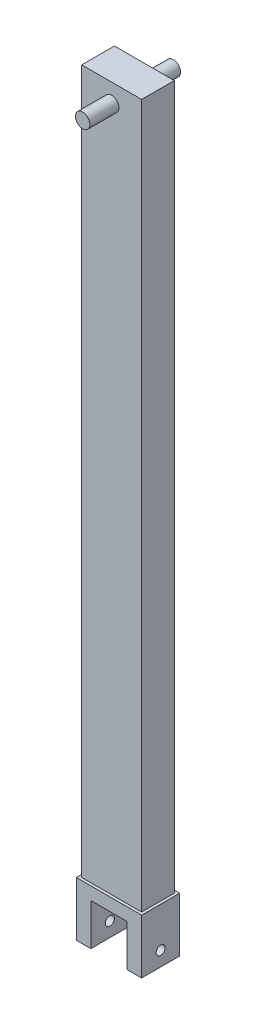
ISO-10303-21;
HEADER;
FILE_DESCRIPTION(('STEP AP214'),'2;1');
FILE_NAME('part.step','',(''),(''),'','','');
FILE_SCHEMA(('AUTOMOTIVE_DESIGN { 1 0 10303 214 1 1 1 1 }'));
ENDSEC;
DATA;
#1=APPLICATION_CONTEXT('core data for automotive mechanical design processes');
#2=APPLICATION_PROTOCOL_DEFINITION('international standard','automotive_design',2000,#1);
#3=PRODUCT_CONTEXT('',#1,'mechanical');
#4=PRODUCT('Part','Part','',(#3));
#5=PRODUCT_RELATED_PRODUCT_CATEGORY('part','',(#4));
#6=PRODUCT_DEFINITION_FORMATION('','',#4);
#7=PRODUCT_DEFINITION_CONTEXT('part definition',#1,'design');
#8=PRODUCT_DEFINITION('design','',#6,#7);
#9=PRODUCT_DEFINITION_SHAPE('','',#8);
#10=(LENGTH_UNIT() NAMED_UNIT(*) SI_UNIT(.MILLI.,.METRE.));
#11=(NAMED_UNIT(*) PLANE_ANGLE_UNIT() SI_UNIT($,.RADIAN.));
#12=(NAMED_UNIT(*) SI_UNIT($,.STERADIAN.) SOLID_ANGLE_UNIT());
#13=UNCERTAINTY_MEASURE_WITH_UNIT(LENGTH_MEASURE(1.E-05),#10,'distance_accuracy_value','');
#14=(GEOMETRIC_REPRESENTATION_CONTEXT(3) GLOBAL_UNCERTAINTY_ASSIGNED_CONTEXT((#13)) GLOBAL_UNIT_ASSIGNED_CONTEXT((#10,
#11,#12)) REPRESENTATION_CONTEXT('',''));
#15=CARTESIAN_POINT('',(0.,0.,0.));
#16=DIRECTION('',(0.,0.,1.));
#17=DIRECTION('',(1.,0.,0.));
#18=AXIS2_PLACEMENT_3D('',#15,#16,#17);
#19=CARTESIAN_POINT('',(0.,-30.,0.));
#20=DIRECTION('',(0.,-1.,0.));
#21=DIRECTION('',(0.,0.,-1.));
#22=AXIS2_PLACEMENT_3D('',#19,#20,#21);
#23=PLANE('',#22);
#24=DIRECTION('',(0.,0.,1.));
#25=VECTOR('',#24,1.);
#26=CARTESIAN_POINT('',(10.,-30.,0.));
#27=LINE('',#26,#25);
#28=CARTESIAN_POINT('',(10.,-30.,-10.5));
#29=VERTEX_POINT('',#28);
#30=CARTESIAN_POINT('',(10.,-30.,10.5));
#31=VERTEX_POINT('',#30);
#32=EDGE_CURVE('E44',#29,#31,#27,.T.);
#33=ORIENTED_EDGE('',*,*,#32,.F.);
#34=DIRECTION('',(1.,0.,0.));
#35=VECTOR('',#34,1.);
#36=CARTESIAN_POINT('',(-18.,-30.,-10.5));
#37=LINE('',#36,#35);
#38=CARTESIAN_POINT('',(18.,-30.,-10.5));
#39=VERTEX_POINT('',#38);
#40=EDGE_CURVE('E171',#29,#39,#37,.T.);
#41=ORIENTED_EDGE('',*,*,#40,.T.);
#42=DIRECTION('',(0.,0.,1.));
#43=VECTOR('',#42,1.);
#44=CARTESIAN_POINT('',(18.,-30.,10.5));
#45=LINE('',#44,#43);
#46=CARTESIAN_POINT('',(18.,-30.,10.5));
#47=VERTEX_POINT('',#46);
#48=EDGE_CURVE('E165',#39,#47,#45,.T.);
#49=ORIENTED_EDGE('',*,*,#48,.T.);
#50=DIRECTION('',(-1.,0.,0.));
#51=VECTOR('',#50,1.);
#52=CARTESIAN_POINT('',(-18.,-30.,10.5));
#53=LINE('',#52,#51);
#54=EDGE_CURVE('E158',#47,#31,#53,.T.);
#55=ORIENTED_EDGE('',*,*,#54,.T.);
#56=EDGE_LOOP('',(#33,#41,#49,#55));
#57=FACE_BOUND('',#56,.T.);
#58=ADVANCED_FACE('F35',(#57),#23,.T.);
#59=CARTESIAN_POINT('',(-16.5,388.,-9.));
#60=DIRECTION('',(0.,0.,1.));
#61=DIRECTION('',(1.,0.,0.));
#62=AXIS2_PLACEMENT_3D('',#59,#60,#61);
#63=PLANE('',#62);
#64=DIRECTION('',(-1.,0.,0.));
#65=VECTOR('',#64,1.);
#66=CARTESIAN_POINT('',(-16.5,0.,-9.));
#67=LINE('',#66,#65);
#68=CARTESIAN_POINT('',(16.5,0.,-9.));
#69=VERTEX_POINT('',#68);
#70=CARTESIAN_POINT('',(-16.5,0.,-9.));
#71=VERTEX_POINT('',#70);
#72=EDGE_CURVE('E81',#69,#71,#67,.T.);
#73=ORIENTED_EDGE('',*,*,#72,.T.);
#74=DIRECTION('',(0.,-1.,0.));
#75=VECTOR('',#74,1.);
#76=CARTESIAN_POINT('',(-16.5,388.,-9.));
#77=LINE('',#76,#75);
#78=CARTESIAN_POINT('',(-16.5,388.,-9.));
#79=VERTEX_POINT('',#78);
#80=EDGE_CURVE('E99',#79,#71,#77,.T.);
#81=ORIENTED_EDGE('',*,*,#80,.F.);
#82=DIRECTION('',(-1.,0.,0.));
#83=VECTOR('',#82,1.);
#84=CARTESIAN_POINT('',(-16.5,388.,-9.));
#85=LINE('',#84,#83);
#86=CARTESIAN_POINT('',(16.5,388.,-9.));
#87=VERTEX_POINT('',#86);
#88=EDGE_CURVE('E87',#87,#79,#85,.T.);
#89=ORIENTED_EDGE('',*,*,#88,.F.);
#90=DIRECTION('',(0.,-1.,0.));
#91=VECTOR('',#90,1.);
#92=CARTESIAN_POINT('',(16.5,388.,-9.));
#93=LINE('',#92,#91);
#94=EDGE_CURVE('E103',#87,#69,#93,.T.);
#95=ORIENTED_EDGE('',*,*,#94,.T.);
#96=EDGE_LOOP('',(#73,#81,#89,#95));
#97=FACE_BOUND('',#96,.T.);
#98=CARTESIAN_POINT('',(0.,377.75,-9.));
#99=DIRECTION('',(0.,0.,1.));
#100=DIRECTION('',(1.,0.,0.));
#101=AXIS2_PLACEMENT_3D('',#98,#99,#100);
#102=CIRCLE('',#101,4.);
#103=CARTESIAN_POINT('',(4.,377.75,-9.));
#104=VERTEX_POINT('',#103);
#105=EDGE_CURVE('E128',#104,#104,#102,.F.);
#106=ORIENTED_EDGE('',*,*,#105,.F.);
#107=EDGE_LOOP('',(#106));
#108=FACE_BOUND('',#107,.T.);
#109=ADVANCED_FACE('F100',(#97,#108),#63,.F.);
#110=CARTESIAN_POINT('',(-16.5,388.,9.));
#111=DIRECTION('',(0.,0.,-1.));
#112=DIRECTION('',(-1.,0.,0.));
#113=AXIS2_PLACEMENT_3D('',#110,#111,#112);
#114=PLANE('',#113);
#115=DIRECTION('',(1.,0.,0.));
#116=VECTOR('',#115,1.);
#117=CARTESIAN_POINT('',(-16.5,0.,9.));
#118=LINE('',#117,#116);
#119=CARTESIAN_POINT('',(-16.5,0.,9.));
#120=VERTEX_POINT('',#119);
#121=CARTESIAN_POINT('',(16.5,0.,9.));
#122=VERTEX_POINT('',#121);
#123=EDGE_CURVE('E73',#120,#122,#118,.T.);
#124=ORIENTED_EDGE('',*,*,#123,.T.);
#125=DIRECTION('',(0.,-1.,0.));
#126=VECTOR('',#125,1.);
#127=CARTESIAN_POINT('',(16.5,388.,9.));
#128=LINE('',#127,#126);
#129=CARTESIAN_POINT('',(16.5,388.,9.));
#130=VERTEX_POINT('',#129);
#131=EDGE_CURVE('E109',#130,#122,#128,.T.);
#132=ORIENTED_EDGE('',*,*,#131,.F.);
#133=DIRECTION('',(1.,0.,0.));
#134=VECTOR('',#133,1.);
#135=CARTESIAN_POINT('',(-16.5,388.,9.));
#136=LINE('',#135,#134);
#137=CARTESIAN_POINT('',(-16.5,388.,9.));
#138=VERTEX_POINT('',#137);
#139=EDGE_CURVE('E60',#138,#130,#136,.T.);
#140=ORIENTED_EDGE('',*,*,#139,.F.);
#141=DIRECTION('',(0.,-1.,0.));
#142=VECTOR('',#141,1.);
#143=CARTESIAN_POINT('',(-16.5,388.,9.));
#144=LINE('',#143,#142);
#145=EDGE_CURVE('E104',#138,#120,#144,.T.);
#146=ORIENTED_EDGE('',*,*,#145,.T.);
#147=EDGE_LOOP('',(#124,#132,#140,#146));
#148=FACE_BOUND('',#147,.T.);
#149=CARTESIAN_POINT('',(0.,377.75,9.));
#150=DIRECTION('',(0.,0.,-1.));
#151=DIRECTION('',(-1.,0.,0.));
#152=AXIS2_PLACEMENT_3D('',#149,#150,#151);
#153=CIRCLE('',#152,4.);
#154=CARTESIAN_POINT('',(-4.,377.75,9.));
#155=VERTEX_POINT('',#154);
#156=EDGE_CURVE('E125',#155,#155,#153,.F.);
#157=ORIENTED_EDGE('',*,*,#156,.F.);
#158=EDGE_LOOP('',(#157));
#159=FACE_BOUND('',#158,.T.);
#160=ADVANCED_FACE('F213',(#148,#159),#114,.F.);
#161=CARTESIAN_POINT('',(16.5,388.,-9.));
#162=DIRECTION('',(-1.,0.,0.));
#163=DIRECTION('',(0.,0.,1.));
#164=AXIS2_PLACEMENT_3D('',#161,#162,#163);
#165=PLANE('',#164);
#166=DIRECTION('',(0.,0.,-1.));
#167=VECTOR('',#166,1.);
#168=CARTESIAN_POINT('',(16.5,0.,-9.));
#169=LINE('',#168,#167);
#170=EDGE_CURVE('E113',#122,#69,#169,.T.);
#171=ORIENTED_EDGE('',*,*,#170,.T.);
#172=ORIENTED_EDGE('',*,*,#94,.F.);
#173=DIRECTION('',(0.,0.,-1.));
#174=VECTOR('',#173,1.);
#175=CARTESIAN_POINT('',(16.5,388.,-9.));
#176=LINE('',#175,#174);
#177=EDGE_CURVE('E94',#130,#87,#176,.T.);
#178=ORIENTED_EDGE('',*,*,#177,.F.);
#179=ORIENTED_EDGE('',*,*,#131,.T.);
#180=EDGE_LOOP('',(#171,#172,#178,#179));
#181=FACE_BOUND('',#180,.T.);
#182=ADVANCED_FACE('F37',(#181),#165,.F.);
#183=CARTESIAN_POINT('',(-16.5,388.,-9.));
#184=DIRECTION('',(1.,0.,0.));
#185=DIRECTION('',(0.,0.,-1.));
#186=AXIS2_PLACEMENT_3D('',#183,#184,#185);
#187=PLANE('',#186);
#188=DIRECTION('',(0.,0.,1.));
#189=VECTOR('',#188,1.);
#190=CARTESIAN_POINT('',(-16.5,0.,-9.));
#191=LINE('',#190,#189);
#192=EDGE_CURVE('E118',#71,#120,#191,.T.);
#193=ORIENTED_EDGE('',*,*,#192,.T.);
#194=ORIENTED_EDGE('',*,*,#145,.F.);
#195=DIRECTION('',(0.,0.,1.));
#196=VECTOR('',#195,1.);
#197=CARTESIAN_POINT('',(-16.5,388.,-9.));
#198=LINE('',#197,#196);
#199=EDGE_CURVE('E91',#79,#138,#198,.T.);
#200=ORIENTED_EDGE('',*,*,#199,.F.);
#201=ORIENTED_EDGE('',*,*,#80,.T.);
#202=EDGE_LOOP('',(#193,#194,#200,#201));
#203=FACE_BOUND('',#202,.T.);
#204=ADVANCED_FACE('F106',(#203),#187,.F.);
#205=CARTESIAN_POINT('',(0.,388.,0.));
#206=DIRECTION('',(0.,1.,0.));
#207=DIRECTION('',(0.,0.,1.));
#208=AXIS2_PLACEMENT_3D('',#205,#206,#207);
#209=PLANE('',#208);
#210=ORIENTED_EDGE('',*,*,#177,.T.);
#211=ORIENTED_EDGE('',*,*,#88,.T.);
#212=ORIENTED_EDGE('',*,*,#199,.T.);
#213=ORIENTED_EDGE('',*,*,#139,.T.);
#214=EDGE_LOOP('',(#210,#211,#212,#213));
#215=FACE_BOUND('',#214,.T.);
#216=ADVANCED_FACE('F89',(#215),#209,.T.);
#217=CARTESIAN_POINT('',(0.,377.75,25.));
#218=DIRECTION('',(0.,0.,1.));
#219=DIRECTION('',(1.,0.,0.));
#220=AXIS2_PLACEMENT_3D('',#217,#218,#219);
#221=PLANE('',#220);
#222=CARTESIAN_POINT('',(0.,377.75,25.));
#223=DIRECTION('',(0.,0.,1.));
#224=DIRECTION('',(1.,0.,0.));
#225=AXIS2_PLACEMENT_3D('',#222,#223,#224);
#226=CIRCLE('',#225,4.);
#227=CARTESIAN_POINT('',(4.,377.75,25.));
#228=VERTEX_POINT('',#227);
#229=EDGE_CURVE('E116',#228,#228,#226,.T.);
#230=ORIENTED_EDGE('',*,*,#229,.T.);
#231=EDGE_LOOP('',(#230));
#232=FACE_BOUND('',#231,.T.);
#233=ADVANCED_FACE('F228',(#232),#221,.T.);
#234=CARTESIAN_POINT('',(0.,377.75,25.));
#235=DIRECTION('',(0.,0.,-1.));
#236=DIRECTION('',(-1.,0.,0.));
#237=AXIS2_PLACEMENT_3D('',#234,#235,#236);
#238=CYLINDRICAL_SURFACE('',#237,4.);
#239=ORIENTED_EDGE('',*,*,#229,.F.);
#240=EDGE_LOOP('',(#239));
#241=FACE_BOUND('',#240,.T.);
#242=ORIENTED_EDGE('',*,*,#156,.T.);
#243=EDGE_LOOP('',(#242));
#244=FACE_BOUND('',#243,.T.);
#245=ADVANCED_FACE('F232',(#241,#244),#238,.T.);
#246=CARTESIAN_POINT('',(0.,377.75,-25.));
#247=DIRECTION('',(0.,0.,1.));
#248=DIRECTION('',(1.,0.,0.));
#249=AXIS2_PLACEMENT_3D('',#246,#247,#248);
#250=CIRCLE('',#249,4.);
#251=CARTESIAN_POINT('',(4.,377.75,-25.));
#252=VERTEX_POINT('',#251);
#253=EDGE_CURVE('E203',#252,#252,#250,.T.);
#254=ORIENTED_EDGE('',*,*,#253,.T.);
#255=EDGE_LOOP('',(#254));
#256=FACE_BOUND('',#255,.T.);
#257=ORIENTED_EDGE('',*,*,#105,.T.);
#258=EDGE_LOOP('',(#257));
#259=FACE_BOUND('',#258,.T.);
#260=ADVANCED_FACE('F211',(#256,#259),#238,.T.);
#261=CARTESIAN_POINT('',(0.,377.75,-25.));
#262=DIRECTION('',(0.,0.,1.));
#263=DIRECTION('',(1.,0.,0.));
#264=AXIS2_PLACEMENT_3D('',#261,#262,#263);
#265=PLANE('',#264);
#266=ORIENTED_EDGE('',*,*,#253,.F.);
#267=EDGE_LOOP('',(#266));
#268=FACE_BOUND('',#267,.T.);
#269=ADVANCED_FACE('F231',(#268),#265,.F.);
#270=CARTESIAN_POINT('',(0.,0.,0.));
#271=DIRECTION('',(0.,-1.,0.));
#272=DIRECTION('',(0.,0.,-1.));
#273=AXIS2_PLACEMENT_3D('',#270,#271,#272);
#274=PLANE('',#273);
#275=DIRECTION('',(0.,0.,1.));
#276=VECTOR('',#275,1.);
#277=CARTESIAN_POINT('',(18.,0.,10.5));
#278=LINE('',#277,#276);
#279=CARTESIAN_POINT('',(18.,0.,-10.5));
#280=VERTEX_POINT('',#279);
#281=CARTESIAN_POINT('',(18.,0.,10.5));
#282=VERTEX_POINT('',#281);
#283=EDGE_CURVE('E181',#280,#282,#278,.T.);
#284=ORIENTED_EDGE('',*,*,#283,.F.);
#285=DIRECTION('',(1.,0.,0.));
#286=VECTOR('',#285,1.);
#287=CARTESIAN_POINT('',(-18.,0.,-10.5));
#288=LINE('',#287,#286);
#289=CARTESIAN_POINT('',(-18.,0.,-10.5));
#290=VERTEX_POINT('',#289);
#291=EDGE_CURVE('E190',#290,#280,#288,.T.);
#292=ORIENTED_EDGE('',*,*,#291,.F.);
#293=DIRECTION('',(0.,0.,-1.));
#294=VECTOR('',#293,1.);
#295=CARTESIAN_POINT('',(-18.,0.,10.5));
#296=LINE('',#295,#294);
#297=CARTESIAN_POINT('',(-18.,0.,10.5));
#298=VERTEX_POINT('',#297);
#299=EDGE_CURVE('E187',#298,#290,#296,.T.);
#300=ORIENTED_EDGE('',*,*,#299,.F.);
#301=DIRECTION('',(-1.,0.,0.));
#302=VECTOR('',#301,1.);
#303=CARTESIAN_POINT('',(-18.,0.,10.5));
#304=LINE('',#303,#302);
#305=EDGE_CURVE('E184',#282,#298,#304,.T.);
#306=ORIENTED_EDGE('',*,*,#305,.F.);
#307=EDGE_LOOP('',(#284,#292,#300,#306));
#308=FACE_BOUND('',#307,.T.);
#309=ORIENTED_EDGE('',*,*,#72,.F.);
#310=ORIENTED_EDGE('',*,*,#170,.F.);
#311=ORIENTED_EDGE('',*,*,#123,.F.);
#312=ORIENTED_EDGE('',*,*,#192,.F.);
#313=EDGE_LOOP('',(#309,#310,#311,#312));
#314=FACE_BOUND('',#313,.T.);
#315=ADVANCED_FACE('F236',(#308,#314),#274,.F.);
#316=CARTESIAN_POINT('',(18.,-30.,10.5));
#317=DIRECTION('',(-1.,0.,0.));
#318=DIRECTION('',(0.,0.,1.));
#319=AXIS2_PLACEMENT_3D('',#316,#317,#318);
#320=PLANE('',#319);
#321=CARTESIAN_POINT('',(18.,-22.,0.));
#322=DIRECTION('',(1.,0.,0.));
#323=DIRECTION('',(0.,0.,-1.));
#324=AXIS2_PLACEMENT_3D('',#321,#322,#323);
#325=CIRCLE('',#324,2.5);
#326=CARTESIAN_POINT('',(18.,-22.,-2.5));
#327=VERTEX_POINT('',#326);
#328=EDGE_CURVE('E282',#327,#327,#325,.T.);
#329=ORIENTED_EDGE('',*,*,#328,.F.);
#330=EDGE_LOOP('',(#329));
#331=FACE_BOUND('',#330,.T.);
#332=ORIENTED_EDGE('',*,*,#283,.T.);
#333=DIRECTION('',(0.,1.,0.));
#334=VECTOR('',#333,1.);
#335=CARTESIAN_POINT('',(18.,-30.,10.5));
#336=LINE('',#335,#334);
#337=EDGE_CURVE('E201',#47,#282,#336,.T.);
#338=ORIENTED_EDGE('',*,*,#337,.F.);
#339=ORIENTED_EDGE('',*,*,#48,.F.);
#340=DIRECTION('',(0.,1.,0.));
#341=VECTOR('',#340,1.);
#342=CARTESIAN_POINT('',(18.,-30.,-10.5));
#343=LINE('',#342,#341);
#344=EDGE_CURVE('E180',#39,#280,#343,.T.);
#345=ORIENTED_EDGE('',*,*,#344,.T.);
#346=EDGE_LOOP('',(#332,#338,#339,#345));
#347=FACE_BOUND('',#346,.T.);
#348=ADVANCED_FACE('F241',(#331,#347),#320,.F.);
#349=CARTESIAN_POINT('',(-18.,-30.,10.5));
#350=DIRECTION('',(0.,0.,-1.));
#351=DIRECTION('',(-1.,0.,0.));
#352=AXIS2_PLACEMENT_3D('',#349,#350,#351);
#353=PLANE('',#352);
#354=DIRECTION('',(-1.,0.,0.));
#355=VECTOR('',#354,1.);
#356=CARTESIAN_POINT('',(-10.,-7.00876086573699,10.5));
#357=LINE('',#356,#355);
#358=CARTESIAN_POINT('',(10.,-7.00876086573699,10.5));
#359=VERTEX_POINT('',#358);
#360=CARTESIAN_POINT('',(-10.,-7.00876086573699,10.5));
#361=VERTEX_POINT('',#360);
#362=EDGE_CURVE('E161',#359,#361,#357,.T.);
#363=ORIENTED_EDGE('',*,*,#362,.F.);
#364=DIRECTION('',(0.,1.,0.));
#365=VECTOR('',#364,1.);
#366=CARTESIAN_POINT('',(10.,-52.991239134263,10.5));
#367=LINE('',#366,#365);
#368=EDGE_CURVE('E141',#31,#359,#367,.T.);
#369=ORIENTED_EDGE('',*,*,#368,.F.);
#370=ORIENTED_EDGE('',*,*,#54,.F.);
#371=ORIENTED_EDGE('',*,*,#337,.T.);
#372=ORIENTED_EDGE('',*,*,#305,.T.);
#373=DIRECTION('',(0.,1.,0.));
#374=VECTOR('',#373,1.);
#375=CARTESIAN_POINT('',(-18.,-30.,10.5));
#376=LINE('',#375,#374);
#377=CARTESIAN_POINT('',(-18.,-30.,10.5));
#378=VERTEX_POINT('',#377);
#379=EDGE_CURVE('E198',#378,#298,#376,.T.);
#380=ORIENTED_EDGE('',*,*,#379,.F.);
#381=CARTESIAN_POINT('',(-10.,-30.,10.5));
#382=VERTEX_POINT('',#381);
#383=EDGE_CURVE('E168',#382,#378,#53,.T.);
#384=ORIENTED_EDGE('',*,*,#383,.F.);
#385=DIRECTION('',(0.,-1.,0.));
#386=VECTOR('',#385,1.);
#387=CARTESIAN_POINT('',(-10.,-52.991239134263,10.5));
#388=LINE('',#387,#386);
#389=EDGE_CURVE('E51',#361,#382,#388,.T.);
#390=ORIENTED_EDGE('',*,*,#389,.F.);
#391=EDGE_LOOP('',(#363,#369,#370,#371,#372,#380,#384,#390));
#392=FACE_BOUND('',#391,.T.);
#393=ADVANCED_FACE('F155',(#392),#353,.F.);
#394=CARTESIAN_POINT('',(-18.,-30.,10.5));
#395=DIRECTION('',(1.,0.,0.));
#396=DIRECTION('',(0.,0.,-1.));
#397=AXIS2_PLACEMENT_3D('',#394,#395,#396);
#398=PLANE('',#397);
#399=CARTESIAN_POINT('',(-18.,-22.,0.));
#400=DIRECTION('',(1.,0.,0.));
#401=DIRECTION('',(0.,0.,-1.));
#402=AXIS2_PLACEMENT_3D('',#399,#400,#401);
#403=CIRCLE('',#402,2.5);
#404=CARTESIAN_POINT('',(-18.,-22.,-2.5));
#405=VERTEX_POINT('',#404);
#406=EDGE_CURVE('E287',#405,#405,#403,.T.);
#407=ORIENTED_EDGE('',*,*,#406,.T.);
#408=EDGE_LOOP('',(#407));
#409=FACE_BOUND('',#408,.T.);
#410=ORIENTED_EDGE('',*,*,#299,.T.);
#411=DIRECTION('',(0.,1.,0.));
#412=VECTOR('',#411,1.);
#413=CARTESIAN_POINT('',(-18.,-30.,-10.5));
#414=LINE('',#413,#412);
#415=CARTESIAN_POINT('',(-18.,-30.,-10.5));
#416=VERTEX_POINT('',#415);
#417=EDGE_CURVE('E195',#416,#290,#414,.T.);
#418=ORIENTED_EDGE('',*,*,#417,.F.);
#419=DIRECTION('',(0.,0.,-1.));
#420=VECTOR('',#419,1.);
#421=CARTESIAN_POINT('',(-18.,-30.,10.5));
#422=LINE('',#421,#420);
#423=EDGE_CURVE('E167',#378,#416,#422,.T.);
#424=ORIENTED_EDGE('',*,*,#423,.F.);
#425=ORIENTED_EDGE('',*,*,#379,.T.);
#426=EDGE_LOOP('',(#410,#418,#424,#425));
#427=FACE_BOUND('',#426,.T.);
#428=ADVANCED_FACE('F247',(#409,#427),#398,.F.);
#429=CARTESIAN_POINT('',(-18.,-30.,-10.5));
#430=DIRECTION('',(0.,0.,1.));
#431=DIRECTION('',(1.,0.,0.));
#432=AXIS2_PLACEMENT_3D('',#429,#430,#431);
#433=PLANE('',#432);
#434=ORIENTED_EDGE('',*,*,#40,.F.);
#435=DIRECTION('',(0.,1.,0.));
#436=VECTOR('',#435,1.);
#437=CARTESIAN_POINT('',(10.,-30.,-10.5));
#438=LINE('',#437,#436);
#439=CARTESIAN_POINT('',(10.,-7.00876086573699,-10.5));
#440=VERTEX_POINT('',#439);
#441=EDGE_CURVE('E145',#29,#440,#438,.T.);
#442=ORIENTED_EDGE('',*,*,#441,.T.);
#443=DIRECTION('',(-1.,0.,0.));
#444=VECTOR('',#443,1.);
#445=CARTESIAN_POINT('',(-18.,-7.00876086573699,-10.5));
#446=LINE('',#445,#444);
#447=CARTESIAN_POINT('',(-10.,-7.00876086573699,-10.5));
#448=VERTEX_POINT('',#447);
#449=EDGE_CURVE('E11',#440,#448,#446,.T.);
#450=ORIENTED_EDGE('',*,*,#449,.T.);
#451=DIRECTION('',(0.,-1.,0.));
#452=VECTOR('',#451,1.);
#453=CARTESIAN_POINT('',(-10.,-30.,-10.5));
#454=LINE('',#453,#452);
#455=CARTESIAN_POINT('',(-10.,-30.,-10.5));
#456=VERTEX_POINT('',#455);
#457=EDGE_CURVE('E296',#448,#456,#454,.T.);
#458=ORIENTED_EDGE('',*,*,#457,.T.);
#459=EDGE_CURVE('E177',#416,#456,#37,.T.);
#460=ORIENTED_EDGE('',*,*,#459,.F.);
#461=ORIENTED_EDGE('',*,*,#417,.T.);
#462=ORIENTED_EDGE('',*,*,#291,.T.);
#463=ORIENTED_EDGE('',*,*,#344,.F.);
#464=EDGE_LOOP('',(#434,#442,#450,#458,#460,#461,#462,#463));
#465=FACE_BOUND('',#464,.T.);
#466=ADVANCED_FACE('F250',(#465),#433,.F.);
#467=DIRECTION('',(0.,0.,-1.));
#468=VECTOR('',#467,1.);
#469=CARTESIAN_POINT('',(-10.,-30.,0.));
#470=LINE('',#469,#468);
#471=EDGE_CURVE('E129',#382,#456,#470,.T.);
#472=ORIENTED_EDGE('',*,*,#471,.F.);
#473=ORIENTED_EDGE('',*,*,#383,.T.);
#474=ORIENTED_EDGE('',*,*,#423,.T.);
#475=ORIENTED_EDGE('',*,*,#459,.T.);
#476=EDGE_LOOP('',(#472,#473,#474,#475));
#477=FACE_BOUND('',#476,.T.);
#478=ADVANCED_FACE('F222',(#477),#23,.T.);
#479=CARTESIAN_POINT('',(-10.,-7.00876086573699,-25.));
#480=DIRECTION('',(0.,1.,0.));
#481=DIRECTION('',(0.,0.,1.));
#482=AXIS2_PLACEMENT_3D('',#479,#480,#481);
#483=PLANE('',#482);
#484=DIRECTION('',(0.,0.,1.));
#485=VECTOR('',#484,1.);
#486=CARTESIAN_POINT('',(10.,-7.00876086573699,-25.));
#487=LINE('',#486,#485);
#488=EDGE_CURVE('E293',#440,#359,#487,.T.);
#489=ORIENTED_EDGE('',*,*,#488,.T.);
#490=ORIENTED_EDGE('',*,*,#362,.T.);
#491=DIRECTION('',(0.,0.,1.));
#492=VECTOR('',#491,1.);
#493=CARTESIAN_POINT('',(-10.,-7.00876086573699,-25.));
#494=LINE('',#493,#492);
#495=EDGE_CURVE('E294',#448,#361,#494,.T.);
#496=ORIENTED_EDGE('',*,*,#495,.F.);
#497=ORIENTED_EDGE('',*,*,#449,.F.);
#498=EDGE_LOOP('',(#489,#490,#496,#497));
#499=FACE_BOUND('',#498,.T.);
#500=ADVANCED_FACE('F259',(#499),#483,.F.);
#501=CARTESIAN_POINT('',(10.,-52.991239134263,-25.));
#502=DIRECTION('',(1.,0.,0.));
#503=DIRECTION('',(0.,0.,-1.));
#504=AXIS2_PLACEMENT_3D('',#501,#502,#503);
#505=PLANE('',#504);
#506=CARTESIAN_POINT('',(10.,-22.,0.));
#507=DIRECTION('',(1.,0.,0.));
#508=DIRECTION('',(0.,0.,-1.));
#509=AXIS2_PLACEMENT_3D('',#506,#507,#508);
#510=CIRCLE('',#509,2.5);
#511=CARTESIAN_POINT('',(10.,-22.,-2.5));
#512=VERTEX_POINT('',#511);
#513=EDGE_CURVE('E162',#512,#512,#510,.T.);
#514=ORIENTED_EDGE('',*,*,#513,.T.);
#515=EDGE_LOOP('',(#514));
#516=FACE_BOUND('',#515,.T.);
#517=ORIENTED_EDGE('',*,*,#32,.T.);
#518=ORIENTED_EDGE('',*,*,#368,.T.);
#519=ORIENTED_EDGE('',*,*,#488,.F.);
#520=ORIENTED_EDGE('',*,*,#441,.F.);
#521=EDGE_LOOP('',(#517,#518,#519,#520));
#522=FACE_BOUND('',#521,.T.);
#523=ADVANCED_FACE('F138',(#516,#522),#505,.F.);
#524=CARTESIAN_POINT('',(-10.,-52.991239134263,-25.));
#525=DIRECTION('',(-1.,0.,0.));
#526=DIRECTION('',(0.,0.,1.));
#527=AXIS2_PLACEMENT_3D('',#524,#525,#526);
#528=PLANE('',#527);
#529=CARTESIAN_POINT('',(-10.,-22.,0.));
#530=DIRECTION('',(-1.,0.,0.));
#531=DIRECTION('',(0.,0.,1.));
#532=AXIS2_PLACEMENT_3D('',#529,#530,#531);
#533=CIRCLE('',#532,2.5);
#534=CARTESIAN_POINT('',(-10.,-22.,2.5));
#535=VERTEX_POINT('',#534);
#536=EDGE_CURVE('E39',#535,#535,#533,.T.);
#537=ORIENTED_EDGE('',*,*,#536,.T.);
#538=EDGE_LOOP('',(#537));
#539=FACE_BOUND('',#538,.T.);
#540=ORIENTED_EDGE('',*,*,#495,.T.);
#541=ORIENTED_EDGE('',*,*,#389,.T.);
#542=ORIENTED_EDGE('',*,*,#471,.T.);
#543=ORIENTED_EDGE('',*,*,#457,.F.);
#544=EDGE_LOOP('',(#540,#541,#542,#543));
#545=FACE_BOUND('',#544,.T.);
#546=ADVANCED_FACE('F263',(#539,#545),#528,.F.);
#547=CARTESIAN_POINT('',(-18.,-22.,0.));
#548=DIRECTION('',(1.,0.,0.));
#549=DIRECTION('',(0.,0.,-1.));
#550=AXIS2_PLACEMENT_3D('',#547,#548,#549);
#551=CYLINDRICAL_SURFACE('',#550,2.5);
#552=ORIENTED_EDGE('',*,*,#406,.F.);
#553=EDGE_LOOP('',(#552));
#554=FACE_BOUND('',#553,.T.);
#555=ORIENTED_EDGE('',*,*,#536,.F.);
#556=EDGE_LOOP('',(#555));
#557=FACE_BOUND('',#556,.T.);
#558=ADVANCED_FACE('F270',(#554,#557),#551,.F.);
#559=ORIENTED_EDGE('',*,*,#328,.T.);
#560=EDGE_LOOP('',(#559));
#561=FACE_BOUND('',#560,.T.);
#562=ORIENTED_EDGE('',*,*,#513,.F.);
#563=EDGE_LOOP('',(#562));
#564=FACE_BOUND('',#563,.T.);
#565=ADVANCED_FACE('F272',(#561,#564),#551,.F.);
#566=CLOSED_SHELL('',(#58,#109,#160,#182,#204,#216,#233,#245,#260,#269,#315,#348,#393,#428,#466,
#478,#500,#523,#546,#558,#565));
#567=MANIFOLD_SOLID_BREP('B2',#566);
#568=ADVANCED_BREP_SHAPE_REPRESENTATION('',(#18,#567),#14);
#569=SHAPE_DEFINITION_REPRESENTATION(#9,#568);
ENDSEC;
END-ISO-10303-21;
